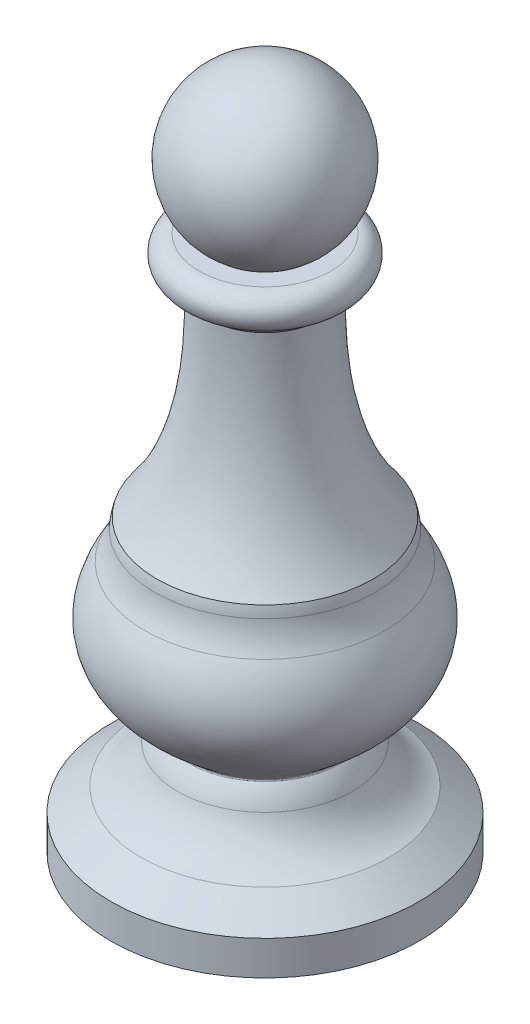
ISO-10303-21;
HEADER;
FILE_DESCRIPTION(('STEP AP214'),'2;1');
FILE_NAME('part.step','',(''),(''),'','','');
FILE_SCHEMA(('AUTOMOTIVE_DESIGN { 1 0 10303 214 1 1 1 1 }'));
ENDSEC;
DATA;
#1=APPLICATION_CONTEXT('core data for automotive mechanical design processes');
#2=APPLICATION_PROTOCOL_DEFINITION('international standard','automotive_design',2000,#1);
#3=PRODUCT_CONTEXT('',#1,'mechanical');
#4=PRODUCT('Part','Part','',(#3));
#5=PRODUCT_RELATED_PRODUCT_CATEGORY('part','',(#4));
#6=PRODUCT_DEFINITION_FORMATION('','',#4);
#7=PRODUCT_DEFINITION_CONTEXT('part definition',#1,'design');
#8=PRODUCT_DEFINITION('design','',#6,#7);
#9=PRODUCT_DEFINITION_SHAPE('','',#8);
#10=(LENGTH_UNIT() NAMED_UNIT(*) SI_UNIT(.MILLI.,.METRE.));
#11=(NAMED_UNIT(*) PLANE_ANGLE_UNIT() SI_UNIT($,.RADIAN.));
#12=(NAMED_UNIT(*) SI_UNIT($,.STERADIAN.) SOLID_ANGLE_UNIT());
#13=UNCERTAINTY_MEASURE_WITH_UNIT(LENGTH_MEASURE(1.E-05),#10,'distance_accuracy_value','');
#14=(GEOMETRIC_REPRESENTATION_CONTEXT(3) GLOBAL_UNCERTAINTY_ASSIGNED_CONTEXT((#13)) GLOBAL_UNIT_ASSIGNED_CONTEXT((#10,
#11,#12)) REPRESENTATION_CONTEXT('',''));
#15=CARTESIAN_POINT('',(0.,0.,0.));
#16=DIRECTION('',(0.,0.,1.));
#17=DIRECTION('',(1.,0.,0.));
#18=AXIS2_PLACEMENT_3D('',#15,#16,#17);
#19=CARTESIAN_POINT('',(6.83333333333332,5.,0.));
#20=CARTESIAN_POINT('',(5.1129156148717,5.48720842067872,0.));
#21=CARTESIAN_POINT('',(18.2724444485722,9.97096116879563,0.));
#22=CARTESIAN_POINT('',(7.63719221446604,20.4603609086045,0.));
#23=CARTESIAN_POINT('',(7.60467731081294,20.8702722180771,0.));
#24=B_SPLINE_CURVE_WITH_KNOTS('',3,(#19,#20,#21,#22,#23),.UNSPECIFIED.,.F.,.F.,(4,1,4),(0.,
0.888569417094027,0.922130153194439),.UNSPECIFIED.);
#25=CARTESIAN_POINT('',(0.,0.,0.));
#26=DIRECTION('',(0.,-1.,0.));
#27=AXIS1_PLACEMENT('',#25,#26);
#28=SURFACE_OF_REVOLUTION('',#24,#27);
#29=CARTESIAN_POINT('',(0.,5.07616143594786,0.));
#30=DIRECTION('',(0.,-1.,0.));
#31=DIRECTION('',(1.,0.,0.));
#32=AXIS2_PLACEMENT_3D('',#29,#30,#31);
#33=CIRCLE('',#32,6.69431931122112);
#34=CARTESIAN_POINT('',(6.69431931122112,5.07616143594786,0.));
#35=VERTEX_POINT('',#34);
#36=EDGE_CURVE('E11',#35,#35,#33,.F.);
#37=ORIENTED_EDGE('',*,*,#36,.T.);
#38=EDGE_LOOP('',(#37));
#39=FACE_BOUND('',#38,.T.);
#40=CARTESIAN_POINT('',(0.,17.0171377516449,0.));
#41=DIRECTION('',(0.,-1.,0.));
#42=DIRECTION('',(1.,0.,0.));
#43=AXIS2_PLACEMENT_3D('',#40,#41,#42);
#44=CIRCLE('',#43,10.5061150858359);
#45=CARTESIAN_POINT('',(10.5061150858359,17.0171377516449,0.));
#46=VERTEX_POINT('',#45);
#47=EDGE_CURVE('E54',#46,#46,#44,.T.);
#48=ORIENTED_EDGE('',*,*,#47,.T.);
#49=EDGE_LOOP('',(#48));
#50=FACE_BOUND('',#49,.T.);
#51=ADVANCED_FACE('F39',(#39,#50),#28,.F.);
#52=CARTESIAN_POINT('',(0.,20.1942158048399,0.));
#53=DIRECTION('',(0.,-1.,0.));
#54=DIRECTION('',(1.,0.,0.));
#55=AXIS2_PLACEMENT_3D('',#52,#53,#54);
#56=TOROIDAL_SURFACE('',#55,15.5959259903693,6.);
#57=CARTESIAN_POINT('',(0.,19.4789777783489,0.));
#58=DIRECTION('',(0.,1.,0.));
#59=DIRECTION('',(-1.,0.,0.));
#60=AXIS2_PLACEMENT_3D('',#57,#58,#59);
#61=CIRCLE('',#60,9.63870897523034);
#62=CARTESIAN_POINT('',(-9.63870897523034,19.4789777783489,0.));
#63=VERTEX_POINT('',#62);
#64=EDGE_CURVE('E50',#63,#63,#61,.F.);
#65=ORIENTED_EDGE('',*,*,#64,.T.);
#66=EDGE_LOOP('',(#65));
#67=FACE_BOUND('',#66,.T.);
#68=ORIENTED_EDGE('',*,*,#47,.F.);
#69=EDGE_LOOP('',(#68));
#70=FACE_BOUND('',#69,.T.);
#71=ADVANCED_FACE('F77',(#67,#70),#56,.F.);
#72=CARTESIAN_POINT('',(0.,0.,0.));
#73=DIRECTION('',(0.,-1.,0.));
#74=DIRECTION('',(0.,0.,-1.));
#75=AXIS2_PLACEMENT_3D('',#72,#73,#74);
#76=CONICAL_SURFACE('',#75,10.8333333333333,0.925024503556996);
#77=CARTESIAN_POINT('',(0.,-2.,0.));
#78=DIRECTION('',(0.,-1.,0.));
#79=DIRECTION('',(0.,0.,-1.));
#80=AXIS2_PLACEMENT_3D('',#77,#78,#79);
#81=CIRCLE('',#80,13.4874229765742);
#82=CARTESIAN_POINT('',(0.,-2.,-13.4874229765742));
#83=VERTEX_POINT('',#82);
#84=EDGE_CURVE('E64',#83,#83,#81,.T.);
#85=ORIENTED_EDGE('',*,*,#84,.F.);
#86=EDGE_LOOP('',(#85));
#87=FACE_BOUND('',#86,.T.);
#88=CARTESIAN_POINT('',(0.,0.,0.));
#89=DIRECTION('',(0.,-1.,0.));
#90=DIRECTION('',(0.,0.,-1.));
#91=AXIS2_PLACEMENT_3D('',#88,#89,#90);
#92=CIRCLE('',#91,10.8333333333333);
#93=CARTESIAN_POINT('',(0.,0.,-10.8333333333333));
#94=VERTEX_POINT('',#93);
#95=EDGE_CURVE('E105',#94,#94,#92,.T.);
#96=ORIENTED_EDGE('',*,*,#95,.T.);
#97=EDGE_LOOP('',(#96));
#98=FACE_BOUND('',#97,.T.);
#99=ADVANCED_FACE('F82',(#87,#98),#76,.T.);
#100=CARTESIAN_POINT('',(0.,5.48431364168173,0.));
#101=DIRECTION('',(0.,-1.,0.));
#102=DIRECTION('',(1.,0.,0.));
#103=AXIS2_PLACEMENT_3D('',#100,#101,#102);
#104=TOROIDAL_SURFACE('',#103,13.2669117437538,6.);
#105=CARTESIAN_POINT('',(0.,3.4054723685598,0.));
#106=DIRECTION('',(0.,1.,0.));
#107=DIRECTION('',(-1.,0.,0.));
#108=AXIS2_PLACEMENT_3D('',#105,#106,#107);
#109=CIRCLE('',#108,7.63855328313979);
#110=CARTESIAN_POINT('',(-7.63855328313979,3.4054723685598,0.));
#111=VERTEX_POINT('',#110);
#112=EDGE_CURVE('E46',#111,#111,#109,.F.);
#113=ORIENTED_EDGE('',*,*,#112,.T.);
#114=EDGE_LOOP('',(#113));
#115=FACE_BOUND('',#114,.T.);
#116=ORIENTED_EDGE('',*,*,#95,.F.);
#117=EDGE_LOOP('',(#116));
#118=FACE_BOUND('',#117,.T.);
#119=ADVANCED_FACE('F84',(#115,#118),#104,.F.);
#120=CARTESIAN_POINT('',(0.,18.763739751858,0.));
#121=DIRECTION('',(0.,-1.,0.));
#122=DIRECTION('',(1.,0.,0.));
#123=AXIS2_PLACEMENT_3D('',#120,#121,#122);
#124=DEGENERATE_TOROIDAL_SURFACE('',#123,3.68149196009136,6.,.T.);
#125=ORIENTED_EDGE('',*,*,#64,.F.);
#126=EDGE_LOOP('',(#125));
#127=FACE_BOUND('',#126,.T.);
#128=CARTESIAN_POINT('',(0.,20.3996633829263,0.));
#129=DIRECTION('',(0.,-1.,0.));
#130=DIRECTION('',(0.,0.,-1.));
#131=AXIS2_PLACEMENT_3D('',#128,#129,#130);
#132=CIRCLE('',#131,9.45416498680197);
#133=CARTESIAN_POINT('',(0.,20.3996633829263,-9.45416498680197));
#134=VERTEX_POINT('',#133);
#135=EDGE_CURVE('E100',#134,#134,#132,.T.);
#136=ORIENTED_EDGE('',*,*,#135,.T.);
#137=EDGE_LOOP('',(#136));
#138=FACE_BOUND('',#137,.T.);
#139=ADVANCED_FACE('F86',(#127,#138),#124,.T.);
#140=CARTESIAN_POINT('',(5.,37.8702722180771,0.));
#141=CARTESIAN_POINT('',(4.67076431342547,26.3049927726696,0.));
#142=CARTESIAN_POINT('',(9.45416498680197,20.3996633829263,0.));
#143=B_SPLINE_CURVE_WITH_KNOTS('',2,(#140,#141,#142),.UNSPECIFIED.,.F.,.F.,(3,3),(0.,
0.759883207088287),.UNSPECIFIED.);
#144=CARTESIAN_POINT('',(0.,0.,0.));
#145=DIRECTION('',(0.,-1.,0.));
#146=AXIS1_PLACEMENT('',#144,#145);
#147=SURFACE_OF_REVOLUTION('',#143,#146);
#148=ORIENTED_EDGE('',*,*,#135,.F.);
#149=EDGE_LOOP('',(#148));
#150=FACE_BOUND('',#149,.T.);
#151=CARTESIAN_POINT('',(0.,37.8702722180771,0.));
#152=DIRECTION('',(0.,-1.,0.));
#153=DIRECTION('',(0.,0.,-1.));
#154=AXIS2_PLACEMENT_3D('',#151,#152,#153);
#155=CIRCLE('',#154,5.);
#156=CARTESIAN_POINT('',(0.,37.8702722180771,-5.));
#157=VERTEX_POINT('',#156);
#158=EDGE_CURVE('E101',#157,#157,#155,.T.);
#159=ORIENTED_EDGE('',*,*,#158,.T.);
#160=EDGE_LOOP('',(#159));
#161=FACE_BOUND('',#160,.T.);
#162=ADVANCED_FACE('F88',(#150,#161),#147,.T.);
#163=CARTESIAN_POINT('',(0.,47.4958641933845,0.));
#164=DIRECTION('',(0.,1.,0.));
#165=DIRECTION('',(0.,0.,-1.));
#166=AXIS2_PLACEMENT_3D('',#163,#164,#165);
#167=SPHERICAL_SURFACE('',#166,7.);
#168=CARTESIAN_POINT('',(0.,41.8702722180771,0.));
#169=DIRECTION('',(0.,1.,0.));
#170=DIRECTION('',(0.,0.,1.));
#171=AXIS2_PLACEMENT_3D('',#168,#169,#170);
#172=CIRCLE('',#171,4.16565900276988);
#173=CARTESIAN_POINT('',(0.,41.8702722180771,4.16565900276988));
#174=VERTEX_POINT('',#173);
#175=EDGE_CURVE('E60',#174,#174,#172,.F.);
#176=ORIENTED_EDGE('',*,*,#175,.F.);
#177=EDGE_LOOP('',(#176));
#178=FACE_BOUND('',#177,.T.);
#179=ADVANCED_FACE('F93',(#178),#167,.T.);
#180=CARTESIAN_POINT('',(0.,41.8702722180771,-5.7535540501028));
#181=DIRECTION('',(0.,1.,0.));
#182=DIRECTION('',(0.,0.,1.));
#183=AXIS2_PLACEMENT_3D('',#180,#181,#182);
#184=PLANE('',#183);
#185=ORIENTED_EDGE('',*,*,#175,.T.);
#186=EDGE_LOOP('',(#185));
#187=FACE_BOUND('',#186,.T.);
#188=CARTESIAN_POINT('',(0.,41.8702722180771,0.));
#189=DIRECTION('',(0.,-1.,0.));
#190=DIRECTION('',(0.,0.,-1.));
#191=AXIS2_PLACEMENT_3D('',#188,#189,#190);
#192=CIRCLE('',#191,5.7535540501028);
#193=CARTESIAN_POINT('',(0.,41.8702722180771,-5.7535540501028));
#194=VERTEX_POINT('',#193);
#195=EDGE_CURVE('E63',#194,#194,#192,.T.);
#196=ORIENTED_EDGE('',*,*,#195,.F.);
#197=EDGE_LOOP('',(#196));
#198=FACE_BOUND('',#197,.T.);
#199=ADVANCED_FACE('F135',(#187,#198),#184,.T.);
#200=CARTESIAN_POINT('',(0.,40.3702722180771,0.));
#201=DIRECTION('',(0.,-1.,0.));
#202=DIRECTION('',(0.,0.,-1.));
#203=AXIS2_PLACEMENT_3D('',#200,#201,#202);
#204=TOROIDAL_SURFACE('',#203,5.7535540501028,1.5);
#205=ORIENTED_EDGE('',*,*,#195,.T.);
#206=EDGE_LOOP('',(#205));
#207=FACE_BOUND('',#206,.T.);
#208=CARTESIAN_POINT('',(0.,38.8702722180771,0.));
#209=DIRECTION('',(0.,1.,0.));
#210=DIRECTION('',(-1.,0.,0.));
#211=AXIS2_PLACEMENT_3D('',#208,#209,#210);
#212=CIRCLE('',#211,5.7535540501028);
#213=CARTESIAN_POINT('',(-5.75355405010279,38.8702722180771,0.));
#214=VERTEX_POINT('',#213);
#215=EDGE_CURVE('E59',#214,#214,#212,.T.);
#216=ORIENTED_EDGE('',*,*,#215,.T.);
#217=EDGE_LOOP('',(#216));
#218=FACE_BOUND('',#217,.T.);
#219=ADVANCED_FACE('F123',(#207,#218),#204,.T.);
#220=CARTESIAN_POINT('',(0.,37.8702722180771,0.));
#221=DIRECTION('',(0.,1.,0.));
#222=DIRECTION('',(-1.,0.,0.));
#223=AXIS2_PLACEMENT_3D('',#220,#221,#222);
#224=CONICAL_SURFACE('',#223,5.,0.645771823237902);
#225=ORIENTED_EDGE('',*,*,#215,.F.);
#226=EDGE_LOOP('',(#225));
#227=FACE_BOUND('',#226,.T.);
#228=ORIENTED_EDGE('',*,*,#158,.F.);
#229=EDGE_LOOP('',(#228));
#230=FACE_BOUND('',#229,.T.);
#231=ADVANCED_FACE('F78',(#227,#230),#224,.T.);
#232=CARTESIAN_POINT('',(0.,1.32663109543787,0.));
#233=DIRECTION('',(0.,1.,0.));
#234=DIRECTION('',(-1.,0.,0.));
#235=AXIS2_PLACEMENT_3D('',#232,#233,#234);
#236=DEGENERATE_TOROIDAL_SURFACE('',#235,2.01019482252582,6.,.T.);
#237=ORIENTED_EDGE('',*,*,#36,.F.);
#238=EDGE_LOOP('',(#237));
#239=FACE_BOUND('',#238,.T.);
#240=ORIENTED_EDGE('',*,*,#112,.F.);
#241=EDGE_LOOP('',(#240));
#242=FACE_BOUND('',#241,.T.);
#243=ADVANCED_FACE('F41',(#239,#242),#236,.T.);
#244=CARTESIAN_POINT('',(0.,-5.,0.));
#245=DIRECTION('',(0.,1.,0.));
#246=DIRECTION('',(0.,0.,1.));
#247=AXIS2_PLACEMENT_3D('',#244,#245,#246);
#248=CYLINDRICAL_SURFACE('',#247,13.4874229765742);
#249=CARTESIAN_POINT('',(0.,-5.,0.));
#250=DIRECTION('',(0.,-1.,0.));
#251=DIRECTION('',(0.,0.,-1.));
#252=AXIS2_PLACEMENT_3D('',#249,#250,#251);
#253=CIRCLE('',#252,13.4874229765742);
#254=CARTESIAN_POINT('',(0.,-5.,-13.4874229765742));
#255=VERTEX_POINT('',#254);
#256=EDGE_CURVE('E102',#255,#255,#253,.T.);
#257=ORIENTED_EDGE('',*,*,#256,.F.);
#258=EDGE_LOOP('',(#257));
#259=FACE_BOUND('',#258,.T.);
#260=ORIENTED_EDGE('',*,*,#84,.T.);
#261=EDGE_LOOP('',(#260));
#262=FACE_BOUND('',#261,.T.);
#263=ADVANCED_FACE('F133',(#259,#262),#248,.T.);
#264=CARTESIAN_POINT('',(0.,-5.,0.));
#265=DIRECTION('',(0.,-1.,0.));
#266=DIRECTION('',(0.,0.,-1.));
#267=AXIS2_PLACEMENT_3D('',#264,#265,#266);
#268=PLANE('',#267);
#269=ORIENTED_EDGE('',*,*,#256,.T.);
#270=EDGE_LOOP('',(#269));
#271=FACE_BOUND('',#270,.T.);
#272=ADVANCED_FACE('F150',(#271),#268,.T.);
#273=CLOSED_SHELL('',(#51,#71,#99,#119,#139,#162,#179,#199,#219,#231,#243,#263,#272));
#274=MANIFOLD_SOLID_BREP('B2',#273);
#275=ADVANCED_BREP_SHAPE_REPRESENTATION('',(#18,#274),#14);
#276=SHAPE_DEFINITION_REPRESENTATION(#9,#275);
ENDSEC;
END-ISO-10303-21;
